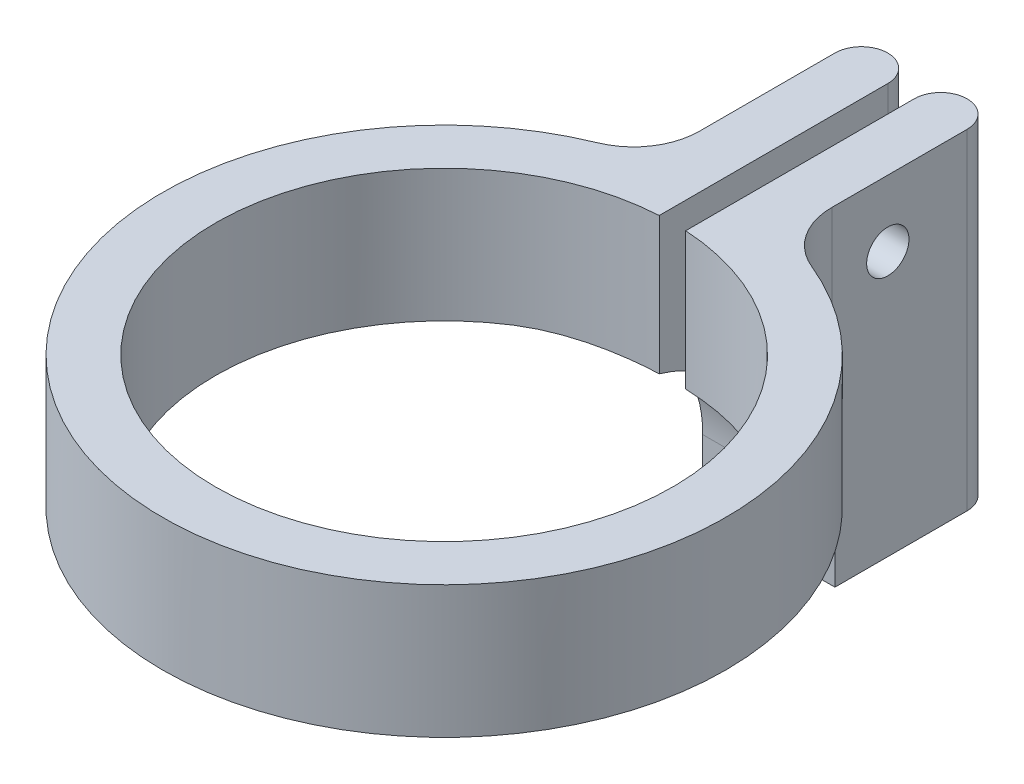
ISO-10303-21;
HEADER;
FILE_DESCRIPTION(('STEP AP214'),'2;1');
FILE_NAME('part.step','',(''),(''),'','','');
FILE_SCHEMA(('AUTOMOTIVE_DESIGN { 1 0 10303 214 1 1 1 1 }'));
ENDSEC;
DATA;
#1=APPLICATION_CONTEXT('core data for automotive mechanical design processes');
#2=APPLICATION_PROTOCOL_DEFINITION('international standard','automotive_design',2000,#1);
#3=PRODUCT_CONTEXT('',#1,'mechanical');
#4=PRODUCT('Part','Part','',(#3));
#5=PRODUCT_RELATED_PRODUCT_CATEGORY('part','',(#4));
#6=PRODUCT_DEFINITION_FORMATION('','',#4);
#7=PRODUCT_DEFINITION_CONTEXT('part definition',#1,'design');
#8=PRODUCT_DEFINITION('design','',#6,#7);
#9=PRODUCT_DEFINITION_SHAPE('','',#8);
#10=(LENGTH_UNIT() NAMED_UNIT(*) SI_UNIT(.MILLI.,.METRE.));
#11=(NAMED_UNIT(*) PLANE_ANGLE_UNIT() SI_UNIT($,.RADIAN.));
#12=(NAMED_UNIT(*) SI_UNIT($,.STERADIAN.) SOLID_ANGLE_UNIT());
#13=UNCERTAINTY_MEASURE_WITH_UNIT(LENGTH_MEASURE(1.E-05),#10,'distance_accuracy_value','');
#14=(GEOMETRIC_REPRESENTATION_CONTEXT(3) GLOBAL_UNCERTAINTY_ASSIGNED_CONTEXT((#13)) GLOBAL_UNIT_ASSIGNED_CONTEXT((#10,
#11,#12)) REPRESENTATION_CONTEXT('',''));
#15=CARTESIAN_POINT('',(0.,0.,0.));
#16=DIRECTION('',(0.,0.,1.));
#17=DIRECTION('',(1.,0.,0.));
#18=AXIS2_PLACEMENT_3D('',#15,#16,#17);
#19=CARTESIAN_POINT('',(0.,0.,0.));
#20=DIRECTION('',(0.,1.,0.));
#21=DIRECTION('',(0.,0.,1.));
#22=AXIS2_PLACEMENT_3D('',#19,#20,#21);
#23=PLANE('',#22);
#24=CARTESIAN_POINT('',(0.,0.,0.));
#25=DIRECTION('',(0.,1.,0.));
#26=DIRECTION('',(0.,0.,1.));
#27=AXIS2_PLACEMENT_3D('',#24,#25,#26);
#28=CIRCLE('',#27,21.3);
#29=CARTESIAN_POINT('',(-15.5449931246049,0.,-14.5617028110035));
#30=VERTEX_POINT('',#29);
#31=CARTESIAN_POINT('',(15.5449931246049,0.,-14.5617028110035));
#32=VERTEX_POINT('',#31);
#33=EDGE_CURVE('E240',#30,#32,#28,.T.);
#34=ORIENTED_EDGE('',*,*,#33,.F.);
#35=DIRECTION('',(-1.,0.,0.));
#36=VECTOR('',#35,1.);
#37=CARTESIAN_POINT('',(-1.,0.,-14.5617028110035));
#38=LINE('',#37,#36);
#39=CARTESIAN_POINT('',(-9.34060015438055,0.,-14.5617028110035));
#40=VERTEX_POINT('',#39);
#41=EDGE_CURVE('E299',#30,#40,#38,.F.);
#42=ORIENTED_EDGE('',*,*,#41,.T.);
#43=CARTESIAN_POINT('',(0.,0.,0.));
#44=DIRECTION('',(0.,1.,0.));
#45=DIRECTION('',(0.,0.,1.));
#46=AXIS2_PLACEMENT_3D('',#43,#44,#45);
#47=CIRCLE('',#46,17.3);
#48=CARTESIAN_POINT('',(9.34060015438055,0.,-14.5617028110035));
#49=VERTEX_POINT('',#48);
#50=EDGE_CURVE('E234',#40,#49,#47,.T.);
#51=ORIENTED_EDGE('',*,*,#50,.T.);
#52=DIRECTION('',(-1.,0.,0.));
#53=VECTOR('',#52,1.);
#54=CARTESIAN_POINT('',(5.,0.,-14.5617028110035));
#55=LINE('',#54,#53);
#56=EDGE_CURVE('E296',#49,#32,#55,.F.);
#57=ORIENTED_EDGE('',*,*,#56,.T.);
#58=EDGE_LOOP('',(#34,#42,#51,#57));
#59=FACE_BOUND('',#58,.T.);
#60=ADVANCED_FACE('F43',(#59),#23,.F.);
#61=CARTESIAN_POINT('',(0.,10.,0.));
#62=DIRECTION('',(0.,-1.,0.));
#63=DIRECTION('',(0.,0.,-1.));
#64=AXIS2_PLACEMENT_3D('',#61,#62,#63);
#65=CYLINDRICAL_SURFACE('',#64,17.3);
#66=ORIENTED_EDGE('',*,*,#50,.F.);
#67=CARTESIAN_POINT('',(-9.34060015438055,0.,-14.5617028110035));
#68=CARTESIAN_POINT('',(-9.16077906497434,-4.30936470180225E-06,-14.6770497903283));
#69=CARTESIAN_POINT('',(-8.97884782876007,-0.00199517160362564,-14.7890467791973));
#70=CARTESIAN_POINT('',(-8.61102967456582,-0.00929198314965414,-15.0061912533817));
#71=CARTESIAN_POINT('',(-8.42514314442597,-0.0145976088582457,-15.1113394061974));
#72=CARTESIAN_POINT('',(-7.86205262243188,-0.0344948752037873,-15.4162333749566));
#73=CARTESIAN_POINT('',(-7.47926551432265,-0.0530680198725525,-15.605526284026));
#74=CARTESIAN_POINT('',(-6.70829415694116,-0.0955996452400158,-15.9519325755325));
#75=CARTESIAN_POINT('',(-6.32034068972378,-0.119452163521084,-16.109576398532));
#76=CARTESIAN_POINT('',(-5.53411388242273,-0.168650382990943,-16.3962985598145));
#77=CARTESIAN_POINT('',(-5.13584140814074,-0.193995959132633,-16.5253792860292));
#78=CARTESIAN_POINT('',(-4.43161577123974,-0.236560100017329,-16.7257063534278));
#79=CARTESIAN_POINT('',(-4.1274896692466,-0.254225686593022,-16.8033428106258));
#80=CARTESIAN_POINT('',(-3.51538309303321,-0.287153480153142,-16.941975323095));
#81=CARTESIAN_POINT('',(-3.20740327504273,-0.302416090474363,-17.0029741722311));
#82=CARTESIAN_POINT('',(-2.58406957830798,-0.329689264563052,-17.1088839009834));
#83=CARTESIAN_POINT('',(-2.26867286887149,-0.341651185178377,-17.1535569982203));
#84=CARTESIAN_POINT('',(-1.79398288301822,-0.356336055107012,-17.2074695214138));
#85=CARTESIAN_POINT('',(-1.6354584605512,-0.360688498709992,-17.2232591671248));
#86=CARTESIAN_POINT('',(-1.31800478510595,-0.368240304646019,-17.250456252837));
#87=CARTESIAN_POINT('',(-1.15907552696496,-0.371439652199068,-17.2618636366679));
#88=CARTESIAN_POINT('',(-1.,-0.374029539448151,-17.2710740835653));
#89=B_SPLINE_CURVE_WITH_KNOTS('',3,(#67,#68,#69,#70,#71,#72,#73,#74,#75,#76,#77,#78,#79,#80,#81,
#82,#83,#84,#85,#86,#87,#88),.UNSPECIFIED.,.F.,.F.,(4,2,2,2,2,2,2,2,2,2,4),(0.,0.64080517413008,
1.28154780044688,2.56249222159771,3.81974401371655,5.07689065734234,6.0195758537496,
6.96210265245717,7.91785633741994,8.39590488130032,8.87395955242858),.UNSPECIFIED.);
#90=CARTESIAN_POINT('',(-1.,-0.374029539448149,-17.2710740835653));
#91=VERTEX_POINT('',#90);
#92=EDGE_CURVE('E341',#40,#91,#89,.T.);
#93=ORIENTED_EDGE('',*,*,#92,.T.);
#94=DIRECTION('',(0.,-1.,0.));
#95=VECTOR('',#94,1.);
#96=CARTESIAN_POINT('',(-1.,10.,-17.2710740835653));
#97=LINE('',#96,#95);
#98=CARTESIAN_POINT('',(-1.,10.,-17.2710740835653));
#99=VERTEX_POINT('',#98);
#100=EDGE_CURVE('E268',#99,#91,#97,.T.);
#101=ORIENTED_EDGE('',*,*,#100,.F.);
#102=CARTESIAN_POINT('',(0.,10.,0.));
#103=DIRECTION('',(0.,1.,0.));
#104=DIRECTION('',(0.,0.,1.));
#105=AXIS2_PLACEMENT_3D('',#102,#103,#104);
#106=CIRCLE('',#105,17.3);
#107=CARTESIAN_POINT('',(1.,10.,-17.2710740835653));
#108=VERTEX_POINT('',#107);
#109=EDGE_CURVE('E235',#99,#108,#106,.T.);
#110=ORIENTED_EDGE('',*,*,#109,.T.);
#111=DIRECTION('',(0.,-1.,0.));
#112=VECTOR('',#111,1.);
#113=CARTESIAN_POINT('',(1.,10.,-17.2710740835653));
#114=LINE('',#113,#112);
#115=CARTESIAN_POINT('',(1.,-0.374029539448149,-17.2710740835653));
#116=VERTEX_POINT('',#115);
#117=EDGE_CURVE('E259',#108,#116,#114,.T.);
#118=ORIENTED_EDGE('',*,*,#117,.T.);
#119=CARTESIAN_POINT('',(1.,-0.374029539448149,-17.2710740835653));
#120=CARTESIAN_POINT('',(1.21306889148462,-0.370568295459475,-17.2587394531481));
#121=CARTESIAN_POINT('',(1.42588789001769,-0.366001229877036,-17.2424590100464));
#122=CARTESIAN_POINT('',(1.85071783452439,-0.354841314791419,-17.2020449771995));
#123=CARTESIAN_POINT('',(2.06272881073217,-0.348248541853659,-17.1779116842657));
#124=CARTESIAN_POINT('',(2.48562250145263,-0.333223779727035,-17.1218332177188));
#125=CARTESIAN_POINT('',(2.69650536211298,-0.32479203499425,-17.0898890823395));
#126=CARTESIAN_POINT('',(3.11687155042701,-0.306353951162151,-17.0182426295121));
#127=CARTESIAN_POINT('',(3.32635485957537,-0.296347591285543,-16.9785402096907));
#128=CARTESIAN_POINT('',(3.94458764227472,-0.264813299200316,-16.8494876049162));
#129=CARTESIAN_POINT('',(4.35100340494661,-0.241468113277681,-16.7491399917748));
#130=CARTESIAN_POINT('',(5.1553196521369,-0.192781194894954,-16.5193108578146));
#131=CARTESIAN_POINT('',(5.55322092638909,-0.16743964863045,-16.3898320519045));
#132=CARTESIAN_POINT('',(6.24074589162522,-0.124444651833706,-16.1382051332841));
#133=CARTESIAN_POINT('',(6.53263793139385,-0.106449301166613,-16.0222737879027));
#134=CARTESIAN_POINT('',(7.10980006880622,-0.0730476597634652,-15.7746424998619));
#135=CARTESIAN_POINT('',(7.39507055824658,-0.0576412155037101,-15.6429434930281));
#136=CARTESIAN_POINT('',(7.96214310434191,-0.0310744384640713,-15.362152974269));
#137=CARTESIAN_POINT('',(8.24384033285562,-0.0199767166002679,-15.2128433535745));
#138=CARTESIAN_POINT('',(8.79880467540931,-0.00445124050960547,-14.8987532701428));
#139=CARTESIAN_POINT('',(9.07206833767056,-2.6182787995829E-05,-14.7339665814931));
#140=CARTESIAN_POINT('',(9.34060015438055,0.,-14.5617028110035));
#141=B_SPLINE_CURVE_WITH_KNOTS('',3,(#119,#120,#121,#122,#123,#124,#125,#126,#127,#128,#129,
#130,#131,#132,#133,#134,#135,#136,#137,#138,#139,#140),.UNSPECIFIED.,.F.,.F.,(4,2,2,2,2,2,2,2,
2,2,4),(0.,0.640315929611236,1.28060766025477,1.92081432819682,2.56102944447447,
3.81764220565609,5.07413790411783,6.01745207257947,6.96071028219039,7.91720348387914,
8.87408311268782),.UNSPECIFIED.);
#142=EDGE_CURVE('E360',#116,#49,#141,.T.);
#143=ORIENTED_EDGE('',*,*,#142,.T.);
#144=EDGE_LOOP('',(#66,#93,#101,#110,#118,#143));
#145=FACE_BOUND('',#144,.T.);
#146=ADVANCED_FACE('F351',(#145),#65,.F.);
#147=CARTESIAN_POINT('',(-1.,10.,0.));
#148=DIRECTION('',(-1.,0.,0.));
#149=DIRECTION('',(0.,0.,1.));
#150=AXIS2_PLACEMENT_3D('',#147,#148,#149);
#151=PLANE('',#150);
#152=CARTESIAN_POINT('',(-1.,5.,-28.5617028110035));
#153=DIRECTION('',(-1.,0.,0.));
#154=DIRECTION('',(0.,0.,1.));
#155=AXIS2_PLACEMENT_3D('',#152,#153,#154);
#156=CIRCLE('',#155,1.6);
#157=CARTESIAN_POINT('',(-1.,5.,-26.9617028110035));
#158=VERTEX_POINT('',#157);
#159=EDGE_CURVE('E230',#158,#158,#156,.T.);
#160=ORIENTED_EDGE('',*,*,#159,.T.);
#161=EDGE_LOOP('',(#160));
#162=FACE_BOUND('',#161,.T.);
#163=DIRECTION('',(0.,0.,1.));
#164=VECTOR('',#163,1.);
#165=CARTESIAN_POINT('',(-1.,-15.,-36.5617028110035));
#166=LINE('',#165,#164);
#167=CARTESIAN_POINT('',(-1.,-15.,-34.5617028110035));
#168=VERTEX_POINT('',#167);
#169=CARTESIAN_POINT('',(-1.,-15.,-24.5617028110035));
#170=VERTEX_POINT('',#169);
#171=EDGE_CURVE('E207',#168,#170,#166,.T.);
#172=ORIENTED_EDGE('',*,*,#171,.F.);
#173=DIRECTION('',(0.,-1.,0.));
#174=VECTOR('',#173,1.);
#175=CARTESIAN_POINT('',(-1.,10.,-34.5617028110035));
#176=LINE('',#175,#174);
#177=CARTESIAN_POINT('',(-1.,10.,-34.5617028110035));
#178=VERTEX_POINT('',#177);
#179=EDGE_CURVE('E53',#168,#178,#176,.F.);
#180=ORIENTED_EDGE('',*,*,#179,.T.);
#181=DIRECTION('',(0.,0.,-1.));
#182=VECTOR('',#181,1.);
#183=CARTESIAN_POINT('',(-1.,10.,0.));
#184=LINE('',#183,#182);
#185=EDGE_CURVE('E239',#99,#178,#184,.T.);
#186=ORIENTED_EDGE('',*,*,#185,.F.);
#187=ORIENTED_EDGE('',*,*,#100,.T.);
#188=CARTESIAN_POINT('',(-1.,-10.,-14.5617028110035));
#189=DIRECTION('',(-1.,0.,0.));
#190=DIRECTION('',(0.,0.,1.));
#191=AXIS2_PLACEMENT_3D('',#188,#189,#190);
#192=CIRCLE('',#191,10.);
#193=CARTESIAN_POINT('',(-1.,-10.,-24.5617028110035));
#194=VERTEX_POINT('',#193);
#195=EDGE_CURVE('E349',#91,#194,#192,.T.);
#196=ORIENTED_EDGE('',*,*,#195,.T.);
#197=DIRECTION('',(0.,1.,0.));
#198=VECTOR('',#197,1.);
#199=CARTESIAN_POINT('',(-1.,-15.,-24.5617028110035));
#200=LINE('',#199,#198);
#201=EDGE_CURVE('E217',#170,#194,#200,.T.);
#202=ORIENTED_EDGE('',*,*,#201,.F.);
#203=EDGE_LOOP('',(#172,#180,#186,#187,#196,#202));
#204=FACE_BOUND('',#203,.T.);
#205=ADVANCED_FACE('F355',(#162,#204),#151,.F.);
#206=CARTESIAN_POINT('',(-5.,10.,0.));
#207=DIRECTION('',(-1.,0.,0.));
#208=DIRECTION('',(0.,0.,1.));
#209=AXIS2_PLACEMENT_3D('',#206,#207,#208);
#210=PLANE('',#209);
#211=CARTESIAN_POINT('',(-5.,5.,-28.5617028110035));
#212=DIRECTION('',(-1.,0.,0.));
#213=DIRECTION('',(0.,0.,1.));
#214=AXIS2_PLACEMENT_3D('',#211,#212,#213);
#215=CIRCLE('',#214,1.6);
#216=CARTESIAN_POINT('',(-5.,5.,-26.9617028110035));
#217=VERTEX_POINT('',#216);
#218=EDGE_CURVE('E226',#217,#217,#215,.T.);
#219=ORIENTED_EDGE('',*,*,#218,.F.);
#220=EDGE_LOOP('',(#219));
#221=FACE_BOUND('',#220,.T.);
#222=DIRECTION('',(0.,0.,-1.));
#223=VECTOR('',#222,1.);
#224=CARTESIAN_POINT('',(-5.,10.,0.));
#225=LINE('',#224,#223);
#226=CARTESIAN_POINT('',(-5.,10.,-24.3246788262456));
#227=VERTEX_POINT('',#226);
#228=CARTESIAN_POINT('',(-5.,10.,-34.5617028110035));
#229=VERTEX_POINT('',#228);
#230=EDGE_CURVE('E244',#227,#229,#225,.T.);
#231=ORIENTED_EDGE('',*,*,#230,.T.);
#232=DIRECTION('',(0.,-1.,0.));
#233=VECTOR('',#232,1.);
#234=CARTESIAN_POINT('',(-5.,10.,-34.5617028110035));
#235=LINE('',#234,#233);
#236=CARTESIAN_POINT('',(-5.,-15.,-34.5617028110035));
#237=VERTEX_POINT('',#236);
#238=EDGE_CURVE('E11',#229,#237,#235,.T.);
#239=ORIENTED_EDGE('',*,*,#238,.T.);
#240=DIRECTION('',(0.,0.,-1.));
#241=VECTOR('',#240,1.);
#242=CARTESIAN_POINT('',(-5.,-15.,-36.5617028110035));
#243=LINE('',#242,#241);
#244=CARTESIAN_POINT('',(-5.,-15.,-24.5617028110035));
#245=VERTEX_POINT('',#244);
#246=EDGE_CURVE('E204',#245,#237,#243,.T.);
#247=ORIENTED_EDGE('',*,*,#246,.F.);
#248=DIRECTION('',(0.,1.,0.));
#249=VECTOR('',#248,1.);
#250=CARTESIAN_POINT('',(-5.,-15.,-24.5617028110035));
#251=LINE('',#250,#249);
#252=CARTESIAN_POINT('',(-5.,-10.,-24.5617028110035));
#253=VERTEX_POINT('',#252);
#254=EDGE_CURVE('E213',#245,#253,#251,.T.);
#255=ORIENTED_EDGE('',*,*,#254,.T.);
#256=CARTESIAN_POINT('',(-5.,-10.,-14.5617028110035));
#257=DIRECTION('',(-1.,0.,0.));
#258=DIRECTION('',(0.,0.,1.));
#259=AXIS2_PLACEMENT_3D('',#256,#257,#258);
#260=CIRCLE('',#259,10.);
#261=CARTESIAN_POINT('',(-5.,-7.83567578080197,-24.3246788262456));
#262=VERTEX_POINT('',#261);
#263=EDGE_CURVE('E304',#253,#262,#260,.F.);
#264=ORIENTED_EDGE('',*,*,#263,.T.);
#265=DIRECTION('',(0.,-1.,0.));
#266=VECTOR('',#265,1.);
#267=CARTESIAN_POINT('',(-5.,10.,-24.3246788262456));
#268=LINE('',#267,#266);
#269=EDGE_CURVE('E280',#262,#227,#268,.F.);
#270=ORIENTED_EDGE('',*,*,#269,.T.);
#271=EDGE_LOOP('',(#231,#239,#247,#255,#264,#270));
#272=FACE_BOUND('',#271,.T.);
#273=ADVANCED_FACE('F387',(#221,#272),#210,.T.);
#274=CARTESIAN_POINT('',(0.,10.,0.));
#275=DIRECTION('',(0.,-1.,0.));
#276=DIRECTION('',(0.,0.,-1.));
#277=AXIS2_PLACEMENT_3D('',#274,#275,#276);
#278=CYLINDRICAL_SURFACE('',#277,21.3);
#279=CARTESIAN_POINT('',(0.,10.,0.));
#280=DIRECTION('',(0.,1.,0.));
#281=DIRECTION('',(0.,0.,1.));
#282=AXIS2_PLACEMENT_3D('',#279,#280,#281);
#283=CIRCLE('',#282,21.3);
#284=CARTESIAN_POINT('',(-8.09885931558935,10.,-19.7002151710658));
#285=VERTEX_POINT('',#284);
#286=CARTESIAN_POINT('',(8.09885931558935,10.,-19.7002151710658));
#287=VERTEX_POINT('',#286);
#288=EDGE_CURVE('E248',#285,#287,#283,.T.);
#289=ORIENTED_EDGE('',*,*,#288,.F.);
#290=DIRECTION('',(0.,-1.,0.));
#291=VECTOR('',#290,1.);
#292=CARTESIAN_POINT('',(-8.09885931558936,10.,-19.7002151710658));
#293=LINE('',#292,#291);
#294=CARTESIAN_POINT('',(-8.09885931558936,-1.42120691906569,-19.7002151710658));
#295=VERTEX_POINT('',#294);
#296=EDGE_CURVE('E277',#285,#295,#293,.T.);
#297=ORIENTED_EDGE('',*,*,#296,.T.);
#298=CARTESIAN_POINT('',(-8.09885931558935,-1.42120691906569,-19.7002151710658));
#299=CARTESIAN_POINT('',(-8.37317556119701,-1.35365332240464,-19.5874333300838));
#300=CARTESIAN_POINT('',(-8.64502636771389,-1.2857270155169,-19.4689845893717));
#301=CARTESIAN_POINT('',(-9.18371389488118,-1.150525183133,-19.2207559199135));
#302=CARTESIAN_POINT('',(-9.45054995647422,-1.08324974373238,-19.0909745142657));
#303=CARTESIAN_POINT('',(-10.2447791421193,-0.884151837150651,-18.6839259433509));
#304=CARTESIAN_POINT('',(-10.764361060803,-0.755450476236059,-18.3895838203984));
#305=CARTESIAN_POINT('',(-11.7675368053469,-0.520816395936304,-17.7638917710928));
#306=CARTESIAN_POINT('',(-12.2517044493837,-0.414396758793345,-17.4336451227395));
#307=CARTESIAN_POINT('',(-13.1941340045459,-0.231557978024537,-16.7316780549529));
#308=CARTESIAN_POINT('',(-13.652439046655,-0.155087541676457,-16.3600299570486));
#309=CARTESIAN_POINT('',(-14.346727662287,-0.0679963425247198,-15.747173223422));
#310=CARTESIAN_POINT('',(-14.5928539465479,-0.043200548845908,-15.519378238449));
#311=CARTESIAN_POINT('',(-15.0762983151677,-0.00915603769479875,-15.0502375923493));
#312=CARTESIAN_POINT('',(-15.3135429476426,-1.70199763350088E-05,-14.8088084633187));
#313=CARTESIAN_POINT('',(-15.5449931246049,0.,-14.5617028110035));
#314=B_SPLINE_CURVE_WITH_KNOTS('',3,(#298,#299,#300,#301,#302,#303,#304,#305,#306,#307,#308,
#309,#310,#311,#312,#313),.UNSPECIFIED.,.F.,.F.,(4,2,2,2,2,2,2,4),(0.,0.912432740340852,
1.82498456920905,3.65517998811738,5.43982874214221,7.22140749650581,8.22957502296375,
9.24477785244163),.UNSPECIFIED.);
#315=EDGE_CURVE('E318',#295,#30,#314,.T.);
#316=ORIENTED_EDGE('',*,*,#315,.T.);
#317=ORIENTED_EDGE('',*,*,#33,.T.);
#318=CARTESIAN_POINT('',(15.5449931246049,0.,-14.5617028110035));
#319=CARTESIAN_POINT('',(15.3989164498857,-2.64901697598371E-06,-14.7176473263575));
#320=CARTESIAN_POINT('',(15.2505176226715,-0.00364750005472828,-14.8713591771143));
#321=CARTESIAN_POINT('',(14.9493538721728,-0.0176169498850412,-15.1740691224644));
#322=CARTESIAN_POINT('',(14.7965899148381,-0.0279400816311894,-15.3230682447847));
#323=CARTESIAN_POINT('',(14.3325166545469,-0.0679843397367044,-15.7623022808546));
#324=CARTESIAN_POINT('',(14.0150029190615,-0.106783846502135,-16.0452251724386));
#325=CARTESIAN_POINT('',(13.3704254672187,-0.203242611154973,-16.5860228747675));
#326=CARTESIAN_POINT('',(13.0435781600225,-0.260608440958975,-16.8442112367871));
#327=CARTESIAN_POINT('',(12.3771869842178,-0.390217008819441,-17.3397718472));
#328=CARTESIAN_POINT('',(12.0376397228563,-0.462463745833307,-17.5771384756536));
#329=CARTESIAN_POINT('',(11.4091095711599,-0.603935729702104,-17.9899169201026));
#330=CARTESIAN_POINT('',(11.121989615912,-0.671375865980648,-18.1688019577689));
#331=CARTESIAN_POINT('',(10.5405766731411,-0.81151608772286,-18.512163430019));
#332=CARTESIAN_POINT('',(10.2462848361217,-0.884215333162787,-18.6766421564475));
#333=CARTESIAN_POINT('',(9.64709179984621,-1.03377139804837,-18.993154570051));
#334=CARTESIAN_POINT('',(9.3421032221683,-1.11066937123464,-19.1450031130962));
#335=CARTESIAN_POINT('',(8.72542796121408,-1.26561385832283,-19.4338034642566));
#336=CARTESIAN_POINT('',(8.41374113396674,-1.34366039690043,-19.5707549517927));
#337=CARTESIAN_POINT('',(8.09885931558935,-1.42120691906569,-19.7002151710658));
#338=B_SPLINE_CURVE_WITH_KNOTS('',3,(#318,#319,#320,#321,#322,#323,#324,#325,#326,#327,#328,
#329,#330,#331,#332,#333,#334,#335,#336,#337),.UNSPECIFIED.,.F.,.F.,(4,2,2,2,2,2,2,2,2,4),(0.,
0.64089829750764,1.28165585393758,2.56132119263431,3.82167641478142,5.08237077606644,
6.11678919854094,7.15104275933876,8.19846638013369,9.24591253663455),.UNSPECIFIED.);
#339=CARTESIAN_POINT('',(8.09885931558936,-1.42120691906569,-19.7002151710658));
#340=VERTEX_POINT('',#339);
#341=EDGE_CURVE('E367',#32,#340,#338,.T.);
#342=ORIENTED_EDGE('',*,*,#341,.T.);
#343=DIRECTION('',(0.,-1.,0.));
#344=VECTOR('',#343,1.);
#345=CARTESIAN_POINT('',(8.09885931558936,10.,-19.7002151710658));
#346=LINE('',#345,#344);
#347=EDGE_CURVE('E271',#340,#287,#346,.F.);
#348=ORIENTED_EDGE('',*,*,#347,.T.);
#349=EDGE_LOOP('',(#289,#297,#316,#317,#342,#348));
#350=FACE_BOUND('',#349,.T.);
#351=ADVANCED_FACE('F382',(#350),#278,.T.);
#352=CARTESIAN_POINT('',(5.,10.,0.));
#353=DIRECTION('',(-1.,0.,0.));
#354=DIRECTION('',(0.,0.,1.));
#355=AXIS2_PLACEMENT_3D('',#352,#353,#354);
#356=PLANE('',#355);
#357=CARTESIAN_POINT('',(5.,5.,-28.5617028110035));
#358=DIRECTION('',(1.,0.,0.));
#359=DIRECTION('',(0.,0.,-1.));
#360=AXIS2_PLACEMENT_3D('',#357,#358,#359);
#361=CIRCLE('',#360,1.6);
#362=CARTESIAN_POINT('',(5.,5.,-30.1617028110035));
#363=VERTEX_POINT('',#362);
#364=EDGE_CURVE('E221',#363,#363,#361,.T.);
#365=ORIENTED_EDGE('',*,*,#364,.F.);
#366=EDGE_LOOP('',(#365));
#367=FACE_BOUND('',#366,.T.);
#368=DIRECTION('',(0.,0.,1.));
#369=VECTOR('',#368,1.);
#370=CARTESIAN_POINT('',(5.,-15.,-36.5617028110035));
#371=LINE('',#370,#369);
#372=CARTESIAN_POINT('',(5.,-15.,-34.5617028110035));
#373=VERTEX_POINT('',#372);
#374=CARTESIAN_POINT('',(5.,-15.,-24.5617028110035));
#375=VERTEX_POINT('',#374);
#376=EDGE_CURVE('E177',#373,#375,#371,.T.);
#377=ORIENTED_EDGE('',*,*,#376,.F.);
#378=DIRECTION('',(0.,-1.,0.));
#379=VECTOR('',#378,1.);
#380=CARTESIAN_POINT('',(5.,10.,-34.5617028110035));
#381=LINE('',#380,#379);
#382=CARTESIAN_POINT('',(5.,10.,-34.5617028110035));
#383=VERTEX_POINT('',#382);
#384=EDGE_CURVE('E427',#373,#383,#381,.F.);
#385=ORIENTED_EDGE('',*,*,#384,.T.);
#386=DIRECTION('',(0.,0.,-1.));
#387=VECTOR('',#386,1.);
#388=CARTESIAN_POINT('',(5.,10.,0.));
#389=LINE('',#388,#387);
#390=CARTESIAN_POINT('',(5.,10.,-24.3246788262456));
#391=VERTEX_POINT('',#390);
#392=EDGE_CURVE('E252',#391,#383,#389,.T.);
#393=ORIENTED_EDGE('',*,*,#392,.F.);
#394=DIRECTION('',(0.,1.,0.));
#395=VECTOR('',#394,1.);
#396=CARTESIAN_POINT('',(5.,0.,-24.3246788262456));
#397=LINE('',#396,#395);
#398=CARTESIAN_POINT('',(5.,-7.83567578080198,-24.3246788262456));
#399=VERTEX_POINT('',#398);
#400=EDGE_CURVE('E283',#391,#399,#397,.F.);
#401=ORIENTED_EDGE('',*,*,#400,.T.);
#402=CARTESIAN_POINT('',(5.,-10.,-14.5617028110035));
#403=DIRECTION('',(-1.,0.,0.));
#404=DIRECTION('',(0.,0.,1.));
#405=AXIS2_PLACEMENT_3D('',#402,#403,#404);
#406=CIRCLE('',#405,10.);
#407=CARTESIAN_POINT('',(5.,-10.,-24.5617028110035));
#408=VERTEX_POINT('',#407);
#409=EDGE_CURVE('E487',#399,#408,#406,.T.);
#410=ORIENTED_EDGE('',*,*,#409,.T.);
#411=DIRECTION('',(0.,1.,0.));
#412=VECTOR('',#411,1.);
#413=CARTESIAN_POINT('',(5.,-15.,-24.5617028110035));
#414=LINE('',#413,#412);
#415=EDGE_CURVE('E192',#375,#408,#414,.T.);
#416=ORIENTED_EDGE('',*,*,#415,.F.);
#417=EDGE_LOOP('',(#377,#385,#393,#401,#410,#416));
#418=FACE_BOUND('',#417,.T.);
#419=ADVANCED_FACE('F386',(#367,#418),#356,.F.);
#420=CARTESIAN_POINT('',(1.,10.,0.));
#421=DIRECTION('',(-1.,0.,0.));
#422=DIRECTION('',(0.,0.,1.));
#423=AXIS2_PLACEMENT_3D('',#420,#421,#422);
#424=PLANE('',#423);
#425=CARTESIAN_POINT('',(1.,5.,-28.5617028110035));
#426=DIRECTION('',(-1.,0.,0.));
#427=DIRECTION('',(0.,0.,1.));
#428=AXIS2_PLACEMENT_3D('',#425,#426,#427);
#429=CIRCLE('',#428,1.6);
#430=CARTESIAN_POINT('',(1.,5.,-26.9617028110035));
#431=VERTEX_POINT('',#430);
#432=EDGE_CURVE('E225',#431,#431,#429,.T.);
#433=ORIENTED_EDGE('',*,*,#432,.F.);
#434=EDGE_LOOP('',(#433));
#435=FACE_BOUND('',#434,.T.);
#436=DIRECTION('',(0.,0.,-1.));
#437=VECTOR('',#436,1.);
#438=CARTESIAN_POINT('',(1.,10.,0.));
#439=LINE('',#438,#437);
#440=CARTESIAN_POINT('',(1.,10.,-34.5617028110035));
#441=VERTEX_POINT('',#440);
#442=EDGE_CURVE('E256',#108,#441,#439,.T.);
#443=ORIENTED_EDGE('',*,*,#442,.T.);
#444=DIRECTION('',(0.,-1.,0.));
#445=VECTOR('',#444,1.);
#446=CARTESIAN_POINT('',(1.,10.,-34.5617028110035));
#447=LINE('',#446,#445);
#448=CARTESIAN_POINT('',(1.,-15.,-34.5617028110035));
#449=VERTEX_POINT('',#448);
#450=EDGE_CURVE('E197',#441,#449,#447,.T.);
#451=ORIENTED_EDGE('',*,*,#450,.T.);
#452=DIRECTION('',(0.,0.,-1.));
#453=VECTOR('',#452,1.);
#454=CARTESIAN_POINT('',(1.,-15.,-36.5617028110035));
#455=LINE('',#454,#453);
#456=CARTESIAN_POINT('',(1.,-15.,-24.5617028110035));
#457=VERTEX_POINT('',#456);
#458=EDGE_CURVE('E174',#457,#449,#455,.T.);
#459=ORIENTED_EDGE('',*,*,#458,.F.);
#460=DIRECTION('',(0.,1.,0.));
#461=VECTOR('',#460,1.);
#462=CARTESIAN_POINT('',(1.,-15.,-24.5617028110035));
#463=LINE('',#462,#461);
#464=CARTESIAN_POINT('',(1.,-10.,-24.5617028110035));
#465=VERTEX_POINT('',#464);
#466=EDGE_CURVE('E185',#457,#465,#463,.T.);
#467=ORIENTED_EDGE('',*,*,#466,.T.);
#468=CARTESIAN_POINT('',(1.,-10.,-14.5617028110035));
#469=DIRECTION('',(-1.,0.,0.));
#470=DIRECTION('',(0.,0.,1.));
#471=AXIS2_PLACEMENT_3D('',#468,#469,#470);
#472=CIRCLE('',#471,10.);
#473=EDGE_CURVE('E368',#465,#116,#472,.F.);
#474=ORIENTED_EDGE('',*,*,#473,.T.);
#475=ORIENTED_EDGE('',*,*,#117,.F.);
#476=EDGE_LOOP('',(#443,#451,#459,#467,#474,#475));
#477=FACE_BOUND('',#476,.T.);
#478=ADVANCED_FACE('F195',(#435,#477),#424,.T.);
#479=CARTESIAN_POINT('',(0.,10.,0.));
#480=DIRECTION('',(0.,1.,0.));
#481=DIRECTION('',(0.,0.,1.));
#482=AXIS2_PLACEMENT_3D('',#479,#480,#481);
#483=PLANE('',#482);
#484=ORIENTED_EDGE('',*,*,#392,.T.);
#485=CARTESIAN_POINT('',(3.,10.,-34.5617028110035));
#486=DIRECTION('',(0.,1.,0.));
#487=DIRECTION('',(0.,0.,1.));
#488=AXIS2_PLACEMENT_3D('',#485,#486,#487);
#489=CIRCLE('',#488,2.);
#490=CARTESIAN_POINT('',(3.,10.,-36.5617028110035));
#491=VERTEX_POINT('',#490);
#492=EDGE_CURVE('E433',#383,#491,#489,.T.);
#493=ORIENTED_EDGE('',*,*,#492,.T.);
#494=CARTESIAN_POINT('',(3.,10.,-34.5617028110035));
#495=DIRECTION('',(0.,1.,0.));
#496=DIRECTION('',(0.,0.,1.));
#497=AXIS2_PLACEMENT_3D('',#494,#495,#496);
#498=CIRCLE('',#497,2.);
#499=EDGE_CURVE('E447',#491,#441,#498,.T.);
#500=ORIENTED_EDGE('',*,*,#499,.T.);
#501=ORIENTED_EDGE('',*,*,#442,.F.);
#502=ORIENTED_EDGE('',*,*,#109,.F.);
#503=ORIENTED_EDGE('',*,*,#185,.T.);
#504=CARTESIAN_POINT('',(-3.,10.,-34.5617028110035));
#505=DIRECTION('',(0.,1.,0.));
#506=DIRECTION('',(0.,0.,1.));
#507=AXIS2_PLACEMENT_3D('',#504,#505,#506);
#508=CIRCLE('',#507,2.);
#509=CARTESIAN_POINT('',(-3.,10.,-36.5617028110035));
#510=VERTEX_POINT('',#509);
#511=EDGE_CURVE('E439',#178,#510,#508,.T.);
#512=ORIENTED_EDGE('',*,*,#511,.T.);
#513=CARTESIAN_POINT('',(-3.,10.,-34.5617028110035));
#514=DIRECTION('',(0.,1.,0.));
#515=DIRECTION('',(0.,0.,1.));
#516=AXIS2_PLACEMENT_3D('',#513,#514,#515);
#517=CIRCLE('',#516,2.);
#518=EDGE_CURVE('E435',#510,#229,#517,.T.);
#519=ORIENTED_EDGE('',*,*,#518,.T.);
#520=ORIENTED_EDGE('',*,*,#230,.F.);
#521=CARTESIAN_POINT('',(-10.,10.,-24.3246788262456));
#522=DIRECTION('',(0.,1.,0.));
#523=DIRECTION('',(0.,0.,1.));
#524=AXIS2_PLACEMENT_3D('',#521,#522,#523);
#525=CIRCLE('',#524,5.);
#526=EDGE_CURVE('E286',#227,#285,#525,.F.);
#527=ORIENTED_EDGE('',*,*,#526,.T.);
#528=ORIENTED_EDGE('',*,*,#288,.T.);
#529=CARTESIAN_POINT('',(10.,10.,-24.3246788262456));
#530=DIRECTION('',(0.,1.,0.));
#531=DIRECTION('',(0.,0.,1.));
#532=AXIS2_PLACEMENT_3D('',#529,#530,#531);
#533=CIRCLE('',#532,5.);
#534=EDGE_CURVE('E289',#287,#391,#533,.F.);
#535=ORIENTED_EDGE('',*,*,#534,.T.);
#536=EDGE_LOOP('',(#484,#493,#500,#501,#502,#503,#512,#519,#520,#527,#528,#535));
#537=FACE_BOUND('',#536,.T.);
#538=ADVANCED_FACE('F406',(#537),#483,.T.);
#539=CARTESIAN_POINT('',(-21.3,5.,-28.5617028110035));
#540=DIRECTION('',(1.,0.,0.));
#541=DIRECTION('',(0.,0.,-1.));
#542=AXIS2_PLACEMENT_3D('',#539,#540,#541);
#543=CYLINDRICAL_SURFACE('',#542,1.6);
#544=ORIENTED_EDGE('',*,*,#432,.T.);
#545=EDGE_LOOP('',(#544));
#546=FACE_BOUND('',#545,.T.);
#547=ORIENTED_EDGE('',*,*,#364,.T.);
#548=EDGE_LOOP('',(#547));
#549=FACE_BOUND('',#548,.T.);
#550=ADVANCED_FACE('F414',(#546,#549),#543,.F.);
#551=ORIENTED_EDGE('',*,*,#218,.T.);
#552=EDGE_LOOP('',(#551));
#553=FACE_BOUND('',#552,.T.);
#554=ORIENTED_EDGE('',*,*,#159,.F.);
#555=EDGE_LOOP('',(#554));
#556=FACE_BOUND('',#555,.T.);
#557=ADVANCED_FACE('F421',(#553,#556),#543,.F.);
#558=CARTESIAN_POINT('',(-10.,10.,-24.3246788262456));
#559=DIRECTION('',(0.,-1.,0.));
#560=DIRECTION('',(0.,0.,-1.));
#561=AXIS2_PLACEMENT_3D('',#558,#559,#560);
#562=CYLINDRICAL_SURFACE('',#561,5.);
#563=ORIENTED_EDGE('',*,*,#526,.F.);
#564=ORIENTED_EDGE('',*,*,#269,.F.);
#565=CARTESIAN_POINT('',(-5.,-7.83567578080198,-24.3246788262456));
#566=CARTESIAN_POINT('',(-5.00000790276771,-7.7055093986206,-24.2958242106925));
#567=CARTESIAN_POINT('',(-5.00024998911872,-7.57592016731424,-24.264363268535));
#568=CARTESIAN_POINT('',(-5.00153073152078,-7.31809821912527,-24.1962849635509));
#569=CARTESIAN_POINT('',(-5.0025694414243,-7.18986559454464,-24.1596672522587));
#570=CARTESIAN_POINT('',(-5.00577430936891,-6.93477071758754,-24.0812722478227));
#571=CARTESIAN_POINT('',(-5.00794228720068,-6.80791101547501,-24.0394867099669));
#572=CARTESIAN_POINT('',(-5.013794424272,-6.55600807708555,-23.9508855519009));
#573=CARTESIAN_POINT('',(-5.01747855045314,-6.43096480126442,-23.9040700413817));
#574=CARTESIAN_POINT('',(-5.03152590853164,-6.05635721882054,-23.7551971118175));
#575=CARTESIAN_POINT('',(-5.04486886624721,-5.809876037515,-23.6454996652512));
#576=CARTESIAN_POINT('',(-5.08344704433947,-5.32748102757461,-23.4070319908559));
#577=CARTESIAN_POINT('',(-5.10867193862369,-5.09155821766646,-23.2782783904314));
#578=CARTESIAN_POINT('',(-5.16448478989526,-4.70916734598729,-23.0492758103134));
#579=CARTESIAN_POINT('',(-5.19047361518525,-4.55912124296877,-22.9538536872895));
#580=CARTESIAN_POINT('',(-5.25130887234049,-4.26552280831979,-22.7560349682159));
#581=CARTESIAN_POINT('',(-5.28615515612998,-4.12197036817791,-22.653638488782));
#582=CARTESIAN_POINT('',(-5.36607357023854,-3.84291610151303,-22.4433717015121));
#583=CARTESIAN_POINT('',(-5.41109948014479,-3.70738127616004,-22.3355277952837));
#584=CARTESIAN_POINT('',(-5.51297209259392,-3.44467508308714,-22.1153154538995));
#585=CARTESIAN_POINT('',(-5.56981621519627,-3.31750189796589,-22.0029480105513));
#586=CARTESIAN_POINT('',(-5.68443462588938,-3.09621030762475,-21.7974401505126));
#587=CARTESIAN_POINT('',(-5.73990767208063,-3.00045244473884,-21.7047790692098));
#588=CARTESIAN_POINT('',(-5.86003769240296,-2.81557308159365,-21.5187991806469));
#589=CARTESIAN_POINT('',(-5.92469289676471,-2.72645030752092,-21.4254805034183));
#590=CARTESIAN_POINT('',(-6.06369802858806,-2.555234404377,-21.2393871924522));
#591=CARTESIAN_POINT('',(-6.13805681395011,-2.47314781311426,-21.1466131377324));
#592=CARTESIAN_POINT('',(-6.2966481404275,-2.31650875933963,-20.9631488946563));
#593=CARTESIAN_POINT('',(-6.38088039482291,-2.24195607816427,-20.8724586458789));
#594=CARTESIAN_POINT('',(-6.55985668856701,-2.10016125716318,-20.694045915865));
#595=CARTESIAN_POINT('',(-6.6546742370479,-2.03297760179682,-20.6063505180707));
#596=CARTESIAN_POINT('',(-6.85398557044491,-1.90674846482169,-20.4362665374778));
#597=CARTESIAN_POINT('',(-6.95847817575588,-1.84770199328742,-20.3538773098101));
#598=CARTESIAN_POINT('',(-7.17634087207222,-1.73788291340888,-20.1961191053205));
#599=CARTESIAN_POINT('',(-7.28969331031555,-1.68709444378623,-20.1207367924636));
#600=CARTESIAN_POINT('',(-7.5245646409194,-1.59358621258194,-19.9782945835219));
#601=CARTESIAN_POINT('',(-7.6460772596022,-1.55086034648821,-19.9112284042677));
#602=CARTESIAN_POINT('',(-7.82454946965208,-1.49549553848223,-19.8223477850145));
#603=CARTESIAN_POINT('',(-7.87861365032812,-1.47964194295857,-19.7966188687625));
#604=CARTESIAN_POINT('',(-7.98788282122073,-1.44936575936544,-19.7470181316922));
#605=CARTESIAN_POINT('',(-8.04308609981367,-1.43494118981441,-19.7231437495975));
#606=CARTESIAN_POINT('',(-8.09885931558935,-1.42120691906569,-19.7002151710658));
#607=B_SPLINE_CURVE_WITH_KNOTS('',3,(#565,#566,#567,#568,#569,#570,#571,#572,#573,#574,#575,
#576,#577,#578,#579,#580,#581,#582,#583,#584,#585,#586,#587,#588,#589,#590,#591,#592,#593,#594,
#595,#596,#597,#598,#599,#600,#601,#602,#603,#604,#605,#606),.UNSPECIFIED.,.F.,.F.,(4,2,2,2,2,2,
2,2,2,2,2,2,2,2,2,2,2,2,2,2,4),(0.,0.399952142157114,0.799931323821852,1.20055706649317,
1.60117407429754,2.41041905721873,3.2189620531737,3.75767450416916,4.29637794975937,
4.83268286876999,5.36887083399596,5.80147298568334,6.23399187049937,6.6669083781654,
7.09981231729466,7.53593537900329,7.9720053374282,8.40722757406494,8.84211895306241,
9.02788641055658,9.21339256845586),.UNSPECIFIED.);
#608=EDGE_CURVE('E308',#262,#295,#607,.T.);
#609=ORIENTED_EDGE('',*,*,#608,.T.);
#610=ORIENTED_EDGE('',*,*,#296,.F.);
#611=EDGE_LOOP('',(#563,#564,#609,#610));
#612=FACE_BOUND('',#611,.T.);
#613=ADVANCED_FACE('F325',(#612),#562,.F.);
#614=CARTESIAN_POINT('',(10.,10.,-24.3246788262456));
#615=DIRECTION('',(0.,-1.,0.));
#616=DIRECTION('',(0.,0.,-1.));
#617=AXIS2_PLACEMENT_3D('',#614,#615,#616);
#618=CYLINDRICAL_SURFACE('',#617,5.);
#619=ORIENTED_EDGE('',*,*,#534,.F.);
#620=ORIENTED_EDGE('',*,*,#347,.F.);
#621=CARTESIAN_POINT('',(8.09885931558935,-1.42120691906569,-19.7002151710658));
#622=CARTESIAN_POINT('',(7.98143457807088,-1.45011062005546,-19.7484576242495));
#623=CARTESIAN_POINT('',(7.86652942806763,-1.48209932392543,-19.8009528277362));
#624=CARTESIAN_POINT('',(7.64256657612462,-1.5523815713435,-19.9135415714153));
#625=CARTESIAN_POINT('',(7.53350691147553,-1.59067298086013,-19.9736325381678));
#626=CARTESIAN_POINT('',(7.32250868609175,-1.67350056316301,-20.1002120308671));
#627=CARTESIAN_POINT('',(7.22053628456157,-1.71800349379528,-20.1666659458271));
#628=CARTESIAN_POINT('',(7.02369862207014,-1.81347600852637,-20.3052123767856));
#629=CARTESIAN_POINT('',(6.92883354737994,-1.86444576201547,-20.3773050404651));
#630=CARTESIAN_POINT('',(6.74674502442786,-1.97280320263532,-20.5259765987788));
#631=CARTESIAN_POINT('',(6.65951541304358,-2.03018562685023,-20.6025517903504));
#632=CARTESIAN_POINT('',(6.4928583890448,-2.15133613323577,-20.7591439971892));
#633=CARTESIAN_POINT('',(6.41343436005663,-2.2151069607257,-20.8391624836612));
#634=CARTESIAN_POINT('',(6.26251668616001,-2.34885290596657,-21.0015016873647));
#635=CARTESIAN_POINT('',(6.19102520575088,-2.41882970777251,-21.0838230253246));
#636=CARTESIAN_POINT('',(6.05592334519869,-2.56472298904131,-21.2496662600264));
#637=CARTESIAN_POINT('',(5.99231391470015,-2.64064018241975,-21.333188300081));
#638=CARTESIAN_POINT('',(5.8693382178196,-2.80260166644429,-21.5052031027938));
#639=CARTESIAN_POINT('',(5.81042361953529,-2.88897694276055,-21.5937065857686));
#640=CARTESIAN_POINT('',(5.70074874089175,-3.06757606899474,-21.7698393687137));
#641=CARTESIAN_POINT('',(5.64998862263483,-3.15980003512753,-21.8574686512733));
#642=CARTESIAN_POINT('',(5.55606109631719,-3.34968200604395,-22.0309606823177));
#643=CARTESIAN_POINT('',(5.51289673700498,-3.44734217217502,-22.1168227093156));
#644=CARTESIAN_POINT('',(5.43355538245619,-3.64761325665962,-22.2859750676003));
#645=CARTESIAN_POINT('',(5.39737986139574,-3.75022521381667,-22.3692648532106));
#646=CARTESIAN_POINT('',(5.31210906573074,-4.02107430840232,-22.5802216833994));
#647=CARTESIAN_POINT('',(5.26776663389621,-4.19271381981395,-22.7054704953059));
#648=CARTESIAN_POINT('',(5.19218966681795,-4.54565271145778,-22.9459601654723));
#649=CARTESIAN_POINT('',(5.16096197354853,-4.72695707841338,-23.0611957750327));
#650=CARTESIAN_POINT('',(5.10892256301638,-5.0982148896415,-23.2805975439774));
#651=CARTESIAN_POINT('',(5.0881392299216,-5.28819038890248,-23.3847329389032));
#652=CARTESIAN_POINT('',(5.05466821950706,-5.67501383806056,-23.5806546962246));
#653=CARTESIAN_POINT('',(5.04197850890413,-5.8718600487779,-23.6724441555951));
#654=CARTESIAN_POINT('',(5.02529434276614,-6.21414149858038,-23.8186635641247));
#655=CARTESIAN_POINT('',(5.01985070804804,-6.35816607209087,-23.8762671102166));
#656=CARTESIAN_POINT('',(5.01127346143778,-6.6487859063033,-23.9847285214125));
#657=CARTESIAN_POINT('',(5.00813958489698,-6.79538087052259,-24.0355871587902));
#658=CARTESIAN_POINT('',(5.00356236728292,-7.08987187886343,-24.1301362587876));
#659=CARTESIAN_POINT('',(5.0021085495816,-7.237754001813,-24.1738696671446));
#660=CARTESIAN_POINT('',(5.00033446902301,-7.53539247127097,-24.2544576643391));
#661=CARTESIAN_POINT('',(5.00001423704296,-7.68514886872038,-24.2913120657768));
#662=CARTESIAN_POINT('',(5.,-7.83567578080198,-24.3246788262456));
#663=B_SPLINE_CURVE_WITH_KNOTS('',3,(#621,#622,#623,#624,#625,#626,#627,#628,#629,#630,#631,
#632,#633,#634,#635,#636,#637,#638,#639,#640,#641,#642,#643,#644,#645,#646,#647,#648,#649,#650,
#651,#652,#653,#654,#655,#656,#657,#658,#659,#660,#661,#662),.UNSPECIFIED.,.F.,.F.,(4,2,2,2,2,2,
2,2,2,2,2,2,2,2,2,2,2,2,2,2,4),(0.,0.390447097509084,0.780762264562577,1.16906342629614,
1.55737476119077,1.94536971525713,2.33353212540106,2.72180019160123,3.11011499169301,
3.52066967548049,3.93123251964512,4.34195977950017,4.75277358089432,5.40294290473967,
6.05345100258001,6.70571752390696,7.357820117961,7.82328322303313,8.28869298774722,
8.75118458463612,9.21368877902327),.UNSPECIFIED.);
#664=EDGE_CURVE('E376',#340,#399,#663,.T.);
#665=ORIENTED_EDGE('',*,*,#664,.T.);
#666=ORIENTED_EDGE('',*,*,#400,.F.);
#667=EDGE_LOOP('',(#619,#620,#665,#666));
#668=FACE_BOUND('',#667,.T.);
#669=ADVANCED_FACE('F335',(#668),#618,.F.);
#670=CARTESIAN_POINT('',(-5.,-15.,-24.5617028110035));
#671=DIRECTION('',(0.,0.,-1.));
#672=DIRECTION('',(-1.,0.,0.));
#673=AXIS2_PLACEMENT_3D('',#670,#671,#672);
#674=PLANE('',#673);
#675=ORIENTED_EDGE('',*,*,#201,.T.);
#676=DIRECTION('',(-1.,0.,0.));
#677=VECTOR('',#676,1.);
#678=CARTESIAN_POINT('',(-5.,-10.,-24.5617028110035));
#679=LINE('',#678,#677);
#680=EDGE_CURVE('E292',#194,#253,#679,.T.);
#681=ORIENTED_EDGE('',*,*,#680,.T.);
#682=ORIENTED_EDGE('',*,*,#254,.F.);
#683=DIRECTION('',(-1.,0.,0.));
#684=VECTOR('',#683,1.);
#685=CARTESIAN_POINT('',(-5.,-15.,-24.5617028110035));
#686=LINE('',#685,#684);
#687=EDGE_CURVE('E210',#170,#245,#686,.T.);
#688=ORIENTED_EDGE('',*,*,#687,.F.);
#689=EDGE_LOOP('',(#675,#681,#682,#688));
#690=FACE_BOUND('',#689,.T.);
#691=ADVANCED_FACE('F502',(#690),#674,.F.);
#692=CARTESIAN_POINT('',(0.,-15.,0.));
#693=DIRECTION('',(0.,1.,0.));
#694=DIRECTION('',(0.,0.,1.));
#695=AXIS2_PLACEMENT_3D('',#692,#693,#694);
#696=PLANE('',#695);
#697=CARTESIAN_POINT('',(-3.,-15.,-34.5617028110035));
#698=DIRECTION('',(0.,1.,0.));
#699=DIRECTION('',(0.,0.,1.));
#700=AXIS2_PLACEMENT_3D('',#697,#698,#699);
#701=CIRCLE('',#700,2.);
#702=CARTESIAN_POINT('',(-3.,-15.,-36.5617028110035));
#703=VERTEX_POINT('',#702);
#704=EDGE_CURVE('E66',#237,#703,#701,.F.);
#705=ORIENTED_EDGE('',*,*,#704,.T.);
#706=CARTESIAN_POINT('',(-3.,-15.,-34.5617028110035));
#707=DIRECTION('',(0.,1.,0.));
#708=DIRECTION('',(0.,0.,1.));
#709=AXIS2_PLACEMENT_3D('',#706,#707,#708);
#710=CIRCLE('',#709,2.);
#711=EDGE_CURVE('E61',#703,#168,#710,.F.);
#712=ORIENTED_EDGE('',*,*,#711,.T.);
#713=ORIENTED_EDGE('',*,*,#171,.T.);
#714=ORIENTED_EDGE('',*,*,#687,.T.);
#715=ORIENTED_EDGE('',*,*,#246,.T.);
#716=EDGE_LOOP('',(#705,#712,#713,#714,#715));
#717=FACE_BOUND('',#716,.T.);
#718=ADVANCED_FACE('F514',(#717),#696,.F.);
#719=CARTESIAN_POINT('',(5.,-15.,-24.5617028110035));
#720=DIRECTION('',(0.,0.,-1.));
#721=DIRECTION('',(-1.,0.,0.));
#722=AXIS2_PLACEMENT_3D('',#719,#720,#721);
#723=PLANE('',#722);
#724=ORIENTED_EDGE('',*,*,#415,.T.);
#725=DIRECTION('',(-1.,0.,0.));
#726=VECTOR('',#725,1.);
#727=CARTESIAN_POINT('',(1.,-10.,-24.5617028110035));
#728=LINE('',#727,#726);
#729=EDGE_CURVE('E188',#408,#465,#728,.T.);
#730=ORIENTED_EDGE('',*,*,#729,.T.);
#731=ORIENTED_EDGE('',*,*,#466,.F.);
#732=DIRECTION('',(-1.,0.,0.));
#733=VECTOR('',#732,1.);
#734=CARTESIAN_POINT('',(5.,-15.,-24.5617028110035));
#735=LINE('',#734,#733);
#736=EDGE_CURVE('E170',#375,#457,#735,.T.);
#737=ORIENTED_EDGE('',*,*,#736,.F.);
#738=EDGE_LOOP('',(#724,#730,#731,#737));
#739=FACE_BOUND('',#738,.T.);
#740=ADVANCED_FACE('F186',(#739),#723,.F.);
#741=CARTESIAN_POINT('',(0.,-15.,0.));
#742=DIRECTION('',(0.,-1.,0.));
#743=DIRECTION('',(0.,0.,-1.));
#744=AXIS2_PLACEMENT_3D('',#741,#742,#743);
#745=PLANE('',#744);
#746=CARTESIAN_POINT('',(3.,-15.,-34.5617028110035));
#747=DIRECTION('',(0.,-1.,0.));
#748=DIRECTION('',(0.,0.,-1.));
#749=AXIS2_PLACEMENT_3D('',#746,#747,#748);
#750=CIRCLE('',#749,2.);
#751=CARTESIAN_POINT('',(3.,-15.,-36.5617028110035));
#752=VERTEX_POINT('',#751);
#753=EDGE_CURVE('E441',#449,#752,#750,.T.);
#754=ORIENTED_EDGE('',*,*,#753,.T.);
#755=CARTESIAN_POINT('',(3.,-15.,-34.5617028110035));
#756=DIRECTION('',(0.,-1.,0.));
#757=DIRECTION('',(0.,0.,-1.));
#758=AXIS2_PLACEMENT_3D('',#755,#756,#757);
#759=CIRCLE('',#758,2.);
#760=EDGE_CURVE('E432',#752,#373,#759,.T.);
#761=ORIENTED_EDGE('',*,*,#760,.T.);
#762=ORIENTED_EDGE('',*,*,#376,.T.);
#763=ORIENTED_EDGE('',*,*,#736,.T.);
#764=ORIENTED_EDGE('',*,*,#458,.T.);
#765=EDGE_LOOP('',(#754,#761,#762,#763,#764));
#766=FACE_BOUND('',#765,.T.);
#767=ADVANCED_FACE('F172',(#766),#745,.T.);
#768=CARTESIAN_POINT('',(-5.,-10.,-14.5617028110035));
#769=DIRECTION('',(1.,0.,0.));
#770=DIRECTION('',(0.,0.,-1.));
#771=AXIS2_PLACEMENT_3D('',#768,#769,#770);
#772=CYLINDRICAL_SURFACE('',#771,10.);
#773=ORIENTED_EDGE('',*,*,#92,.F.);
#774=ORIENTED_EDGE('',*,*,#41,.F.);
#775=ORIENTED_EDGE('',*,*,#315,.F.);
#776=ORIENTED_EDGE('',*,*,#608,.F.);
#777=ORIENTED_EDGE('',*,*,#263,.F.);
#778=ORIENTED_EDGE('',*,*,#680,.F.);
#779=ORIENTED_EDGE('',*,*,#195,.F.);
#780=EDGE_LOOP('',(#773,#774,#775,#776,#777,#778,#779));
#781=FACE_BOUND('',#780,.T.);
#782=ADVANCED_FACE('F329',(#781),#772,.F.);
#783=CARTESIAN_POINT('',(5.,-10.,-14.5617028110035));
#784=DIRECTION('',(1.,0.,0.));
#785=DIRECTION('',(0.,0.,-1.));
#786=AXIS2_PLACEMENT_3D('',#783,#784,#785);
#787=CYLINDRICAL_SURFACE('',#786,10.);
#788=ORIENTED_EDGE('',*,*,#341,.F.);
#789=ORIENTED_EDGE('',*,*,#56,.F.);
#790=ORIENTED_EDGE('',*,*,#142,.F.);
#791=ORIENTED_EDGE('',*,*,#473,.F.);
#792=ORIENTED_EDGE('',*,*,#729,.F.);
#793=ORIENTED_EDGE('',*,*,#409,.F.);
#794=ORIENTED_EDGE('',*,*,#664,.F.);
#795=EDGE_LOOP('',(#788,#789,#790,#791,#792,#793,#794));
#796=FACE_BOUND('',#795,.T.);
#797=ADVANCED_FACE('F333',(#796),#787,.F.);
#798=CARTESIAN_POINT('',(3.,10.,-34.5617028110035));
#799=DIRECTION('',(0.,-1.,0.));
#800=DIRECTION('',(0.,0.,-1.));
#801=AXIS2_PLACEMENT_3D('',#798,#799,#800);
#802=CYLINDRICAL_SURFACE('',#801,2.);
#803=ORIENTED_EDGE('',*,*,#450,.F.);
#804=ORIENTED_EDGE('',*,*,#499,.F.);
#805=DIRECTION('',(0.,-1.,0.));
#806=VECTOR('',#805,1.);
#807=CARTESIAN_POINT('',(3.,10.,-36.5617028110035));
#808=LINE('',#807,#806);
#809=EDGE_CURVE('E460',#752,#491,#808,.F.);
#810=ORIENTED_EDGE('',*,*,#809,.F.);
#811=ORIENTED_EDGE('',*,*,#753,.F.);
#812=EDGE_LOOP('',(#803,#804,#810,#811));
#813=FACE_BOUND('',#812,.T.);
#814=ADVANCED_FACE('F511',(#813),#802,.T.);
#815=CARTESIAN_POINT('',(3.,10.,-34.5617028110035));
#816=DIRECTION('',(0.,1.,0.));
#817=DIRECTION('',(0.,0.,1.));
#818=AXIS2_PLACEMENT_3D('',#815,#816,#817);
#819=CYLINDRICAL_SURFACE('',#818,2.);
#820=ORIENTED_EDGE('',*,*,#492,.F.);
#821=ORIENTED_EDGE('',*,*,#384,.F.);
#822=ORIENTED_EDGE('',*,*,#760,.F.);
#823=ORIENTED_EDGE('',*,*,#809,.T.);
#824=EDGE_LOOP('',(#820,#821,#822,#823));
#825=FACE_BOUND('',#824,.T.);
#826=ADVANCED_FACE('F430',(#825),#819,.T.);
#827=CARTESIAN_POINT('',(-3.,10.,-34.5617028110035));
#828=DIRECTION('',(0.,-1.,0.));
#829=DIRECTION('',(0.,0.,-1.));
#830=AXIS2_PLACEMENT_3D('',#827,#828,#829);
#831=CYLINDRICAL_SURFACE('',#830,2.);
#832=ORIENTED_EDGE('',*,*,#238,.F.);
#833=ORIENTED_EDGE('',*,*,#518,.F.);
#834=DIRECTION('',(0.,-1.,0.));
#835=VECTOR('',#834,1.);
#836=CARTESIAN_POINT('',(-3.,10.,-36.5617028110035));
#837=LINE('',#836,#835);
#838=EDGE_CURVE('E47',#703,#510,#837,.F.);
#839=ORIENTED_EDGE('',*,*,#838,.F.);
#840=ORIENTED_EDGE('',*,*,#704,.F.);
#841=EDGE_LOOP('',(#832,#833,#839,#840));
#842=FACE_BOUND('',#841,.T.);
#843=ADVANCED_FACE('F45',(#842),#831,.T.);
#844=CARTESIAN_POINT('',(-3.,10.,-34.5617028110035));
#845=DIRECTION('',(0.,1.,0.));
#846=DIRECTION('',(0.,0.,1.));
#847=AXIS2_PLACEMENT_3D('',#844,#845,#846);
#848=CYLINDRICAL_SURFACE('',#847,2.);
#849=ORIENTED_EDGE('',*,*,#511,.F.);
#850=ORIENTED_EDGE('',*,*,#179,.F.);
#851=ORIENTED_EDGE('',*,*,#711,.F.);
#852=ORIENTED_EDGE('',*,*,#838,.T.);
#853=EDGE_LOOP('',(#849,#850,#851,#852));
#854=FACE_BOUND('',#853,.T.);
#855=ADVANCED_FACE('F467',(#854),#848,.T.);
#856=CLOSED_SHELL('',(#60,#146,#205,#273,#351,#419,#478,#538,#550,#557,#613,#669,#691,#718,#740,
#767,#782,#797,#814,#826,#843,#855));
#857=MANIFOLD_SOLID_BREP('B2',#856);
#858=ADVANCED_BREP_SHAPE_REPRESENTATION('',(#18,#857),#14);
#859=SHAPE_DEFINITION_REPRESENTATION(#9,#858);
ENDSEC;
END-ISO-10303-21;
